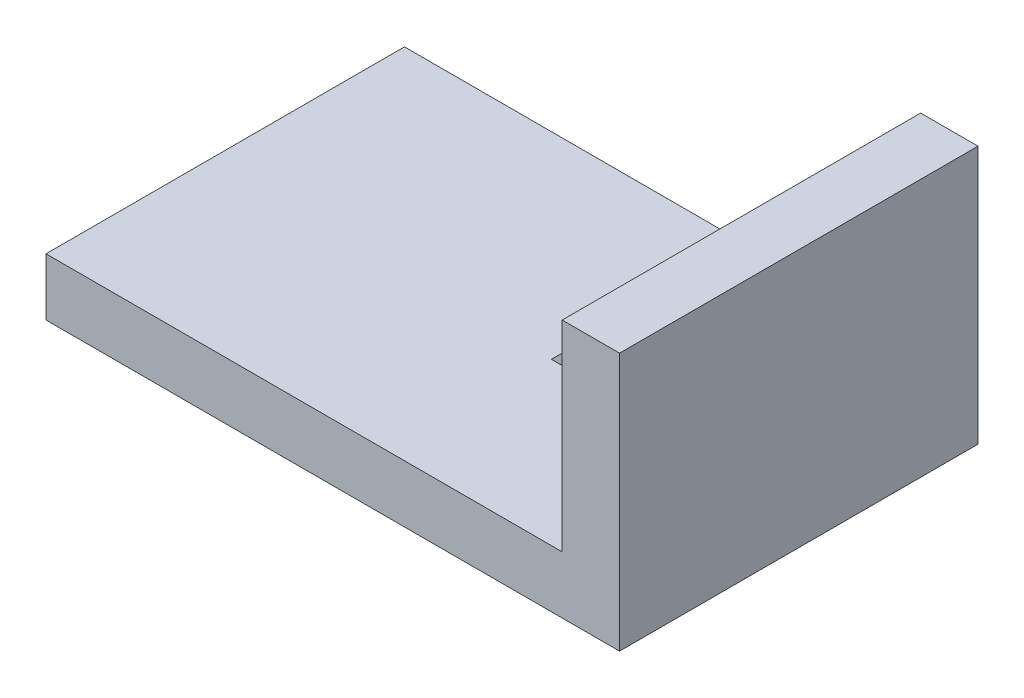
ISO-10303-21;
HEADER;
FILE_DESCRIPTION(('STEP AP214'),'2;1');
FILE_NAME('part.step','',(''),(''),'','','');
FILE_SCHEMA(('AUTOMOTIVE_DESIGN { 1 0 10303 214 1 1 1 1 }'));
ENDSEC;
DATA;
#1=APPLICATION_CONTEXT('core data for automotive mechanical design processes');
#2=APPLICATION_PROTOCOL_DEFINITION('international standard','automotive_design',2000,#1);
#3=PRODUCT_CONTEXT('',#1,'mechanical');
#4=PRODUCT('Part','Part','',(#3));
#5=PRODUCT_RELATED_PRODUCT_CATEGORY('part','',(#4));
#6=PRODUCT_DEFINITION_FORMATION('','',#4);
#7=PRODUCT_DEFINITION_CONTEXT('part definition',#1,'design');
#8=PRODUCT_DEFINITION('design','',#6,#7);
#9=PRODUCT_DEFINITION_SHAPE('','',#8);
#10=(LENGTH_UNIT() NAMED_UNIT(*) SI_UNIT(.MILLI.,.METRE.));
#11=(NAMED_UNIT(*) PLANE_ANGLE_UNIT() SI_UNIT($,.RADIAN.));
#12=(NAMED_UNIT(*) SI_UNIT($,.STERADIAN.) SOLID_ANGLE_UNIT());
#13=UNCERTAINTY_MEASURE_WITH_UNIT(LENGTH_MEASURE(1.E-05),#10,'distance_accuracy_value','');
#14=(GEOMETRIC_REPRESENTATION_CONTEXT(3) GLOBAL_UNCERTAINTY_ASSIGNED_CONTEXT((#13)) GLOBAL_UNIT_ASSIGNED_CONTEXT((#10,
#11,#12)) REPRESENTATION_CONTEXT('',''));
#15=CARTESIAN_POINT('',(0.,0.,0.));
#16=DIRECTION('',(0.,0.,1.));
#17=DIRECTION('',(1.,0.,0.));
#18=AXIS2_PLACEMENT_3D('',#15,#16,#17);
#19=CARTESIAN_POINT('',(-40.,8.,25.));
#20=DIRECTION('',(1.,0.,0.));
#21=DIRECTION('',(0.,0.,-1.));
#22=AXIS2_PLACEMENT_3D('',#19,#20,#21);
#23=PLANE('',#22);
#24=DIRECTION('',(0.,-1.,0.));
#25=VECTOR('',#24,1.);
#26=CARTESIAN_POINT('',(-40.,8.,-25.));
#27=LINE('',#26,#25);
#28=CARTESIAN_POINT('',(-40.,8.,-25.));
#29=VERTEX_POINT('',#28);
#30=CARTESIAN_POINT('',(-40.,0.,-25.));
#31=VERTEX_POINT('',#30);
#32=EDGE_CURVE('E153',#29,#31,#27,.T.);
#33=ORIENTED_EDGE('',*,*,#32,.T.);
#34=DIRECTION('',(0.,0.,-1.));
#35=VECTOR('',#34,1.);
#36=CARTESIAN_POINT('',(-40.,0.,25.));
#37=LINE('',#36,#35);
#38=CARTESIAN_POINT('',(-40.,0.,25.));
#39=VERTEX_POINT('',#38);
#40=EDGE_CURVE('E11',#39,#31,#37,.T.);
#41=ORIENTED_EDGE('',*,*,#40,.F.);
#42=DIRECTION('',(0.,-1.,0.));
#43=VECTOR('',#42,1.);
#44=CARTESIAN_POINT('',(-40.,8.,25.));
#45=LINE('',#44,#43);
#46=CARTESIAN_POINT('',(-40.,8.,25.));
#47=VERTEX_POINT('',#46);
#48=EDGE_CURVE('E154',#47,#39,#45,.T.);
#49=ORIENTED_EDGE('',*,*,#48,.F.);
#50=DIRECTION('',(0.,0.,-1.));
#51=VECTOR('',#50,1.);
#52=CARTESIAN_POINT('',(-40.,8.,25.));
#53=LINE('',#52,#51);
#54=EDGE_CURVE('E173',#47,#29,#53,.T.);
#55=ORIENTED_EDGE('',*,*,#54,.T.);
#56=EDGE_LOOP('',(#33,#41,#49,#55));
#57=FACE_BOUND('',#56,.T.);
#58=ADVANCED_FACE('F51',(#57),#23,.F.);
#59=CARTESIAN_POINT('',(-40.,0.,25.));
#60=DIRECTION('',(0.,1.,0.));
#61=DIRECTION('',(0.,0.,1.));
#62=AXIS2_PLACEMENT_3D('',#59,#60,#61);
#63=PLANE('',#62);
#64=DIRECTION('',(1.,0.,0.));
#65=VECTOR('',#64,1.);
#66=CARTESIAN_POINT('',(-40.,0.,-25.));
#67=LINE('',#66,#65);
#68=CARTESIAN_POINT('',(40.,0.,-25.));
#69=VERTEX_POINT('',#68);
#70=EDGE_CURVE('E176',#31,#69,#67,.T.);
#71=ORIENTED_EDGE('',*,*,#70,.T.);
#72=DIRECTION('',(0.,0.,-1.));
#73=VECTOR('',#72,1.);
#74=CARTESIAN_POINT('',(40.,0.,25.));
#75=LINE('',#74,#73);
#76=CARTESIAN_POINT('',(40.,0.,25.));
#77=VERTEX_POINT('',#76);
#78=EDGE_CURVE('E60',#77,#69,#75,.T.);
#79=ORIENTED_EDGE('',*,*,#78,.F.);
#80=DIRECTION('',(1.,0.,0.));
#81=VECTOR('',#80,1.);
#82=CARTESIAN_POINT('',(-40.,0.,25.));
#83=LINE('',#82,#81);
#84=EDGE_CURVE('E158',#39,#77,#83,.T.);
#85=ORIENTED_EDGE('',*,*,#84,.F.);
#86=ORIENTED_EDGE('',*,*,#40,.T.);
#87=EDGE_LOOP('',(#71,#79,#85,#86));
#88=FACE_BOUND('',#87,.T.);
#89=ADVANCED_FACE('F234',(#88),#63,.F.);
#90=CARTESIAN_POINT('',(40.,0.,25.));
#91=DIRECTION('',(-1.,0.,0.));
#92=DIRECTION('',(0.,0.,1.));
#93=AXIS2_PLACEMENT_3D('',#90,#91,#92);
#94=PLANE('',#93);
#95=DIRECTION('',(0.,1.,0.));
#96=VECTOR('',#95,1.);
#97=CARTESIAN_POINT('',(40.,0.,-25.));
#98=LINE('',#97,#96);
#99=CARTESIAN_POINT('',(40.,36.,-25.));
#100=VERTEX_POINT('',#99);
#101=EDGE_CURVE('E179',#69,#100,#98,.T.);
#102=ORIENTED_EDGE('',*,*,#101,.T.);
#103=DIRECTION('',(0.,0.,-1.));
#104=VECTOR('',#103,1.);
#105=CARTESIAN_POINT('',(40.,36.,25.));
#106=LINE('',#105,#104);
#107=CARTESIAN_POINT('',(40.,36.,25.));
#108=VERTEX_POINT('',#107);
#109=EDGE_CURVE('E202',#108,#100,#106,.T.);
#110=ORIENTED_EDGE('',*,*,#109,.F.);
#111=DIRECTION('',(0.,1.,0.));
#112=VECTOR('',#111,1.);
#113=CARTESIAN_POINT('',(40.,0.,25.));
#114=LINE('',#113,#112);
#115=EDGE_CURVE('E162',#77,#108,#114,.T.);
#116=ORIENTED_EDGE('',*,*,#115,.F.);
#117=ORIENTED_EDGE('',*,*,#78,.T.);
#118=EDGE_LOOP('',(#102,#110,#116,#117));
#119=FACE_BOUND('',#118,.T.);
#120=ADVANCED_FACE('F212',(#119),#94,.F.);
#121=CARTESIAN_POINT('',(40.,36.,25.));
#122=DIRECTION('',(0.,-1.,0.));
#123=DIRECTION('',(0.,0.,-1.));
#124=AXIS2_PLACEMENT_3D('',#121,#122,#123);
#125=PLANE('',#124);
#126=DIRECTION('',(-1.,0.,0.));
#127=VECTOR('',#126,1.);
#128=CARTESIAN_POINT('',(40.,36.,-25.));
#129=LINE('',#128,#127);
#130=CARTESIAN_POINT('',(32.,36.,-25.));
#131=VERTEX_POINT('',#130);
#132=EDGE_CURVE('E182',#100,#131,#129,.T.);
#133=ORIENTED_EDGE('',*,*,#132,.T.);
#134=DIRECTION('',(0.,0.,-1.));
#135=VECTOR('',#134,1.);
#136=CARTESIAN_POINT('',(32.,36.,25.));
#137=LINE('',#136,#135);
#138=CARTESIAN_POINT('',(32.,36.,25.));
#139=VERTEX_POINT('',#138);
#140=EDGE_CURVE('E198',#139,#131,#137,.T.);
#141=ORIENTED_EDGE('',*,*,#140,.F.);
#142=DIRECTION('',(-1.,0.,0.));
#143=VECTOR('',#142,1.);
#144=CARTESIAN_POINT('',(40.,36.,25.));
#145=LINE('',#144,#143);
#146=EDGE_CURVE('E164',#108,#139,#145,.T.);
#147=ORIENTED_EDGE('',*,*,#146,.F.);
#148=ORIENTED_EDGE('',*,*,#109,.T.);
#149=EDGE_LOOP('',(#133,#141,#147,#148));
#150=FACE_BOUND('',#149,.T.);
#151=ADVANCED_FACE('F223',(#150),#125,.F.);
#152=CARTESIAN_POINT('',(32.,36.,25.));
#153=DIRECTION('',(1.,0.,0.));
#154=DIRECTION('',(0.,0.,-1.));
#155=AXIS2_PLACEMENT_3D('',#152,#153,#154);
#156=PLANE('',#155);
#157=DIRECTION('',(0.,0.,-1.));
#158=VECTOR('',#157,1.);
#159=CARTESIAN_POINT('',(32.,32.,2.5));
#160=LINE('',#159,#158);
#161=CARTESIAN_POINT('',(32.,32.,2.5));
#162=VERTEX_POINT('',#161);
#163=CARTESIAN_POINT('',(32.,32.,-2.5));
#164=VERTEX_POINT('',#163);
#165=EDGE_CURVE('E67',#162,#164,#160,.T.);
#166=ORIENTED_EDGE('',*,*,#165,.F.);
#167=DIRECTION('',(0.,1.,0.));
#168=VECTOR('',#167,1.);
#169=CARTESIAN_POINT('',(32.,8.,2.5));
#170=LINE('',#169,#168);
#171=CARTESIAN_POINT('',(32.,8.,2.5));
#172=VERTEX_POINT('',#171);
#173=EDGE_CURVE('E238',#172,#162,#170,.T.);
#174=ORIENTED_EDGE('',*,*,#173,.F.);
#175=DIRECTION('',(0.,0.,-1.));
#176=VECTOR('',#175,1.);
#177=CARTESIAN_POINT('',(32.,8.,25.));
#178=LINE('',#177,#176);
#179=CARTESIAN_POINT('',(32.,8.,25.));
#180=VERTEX_POINT('',#179);
#181=EDGE_CURVE('E195',#180,#172,#178,.T.);
#182=ORIENTED_EDGE('',*,*,#181,.F.);
#183=DIRECTION('',(0.,-1.,0.));
#184=VECTOR('',#183,1.);
#185=CARTESIAN_POINT('',(32.,36.,25.));
#186=LINE('',#185,#184);
#187=EDGE_CURVE('E167',#139,#180,#186,.T.);
#188=ORIENTED_EDGE('',*,*,#187,.F.);
#189=ORIENTED_EDGE('',*,*,#140,.T.);
#190=DIRECTION('',(0.,-1.,0.));
#191=VECTOR('',#190,1.);
#192=CARTESIAN_POINT('',(32.,36.,-25.));
#193=LINE('',#192,#191);
#194=CARTESIAN_POINT('',(32.,8.,-25.));
#195=VERTEX_POINT('',#194);
#196=EDGE_CURVE('E185',#131,#195,#193,.T.);
#197=ORIENTED_EDGE('',*,*,#196,.T.);
#198=CARTESIAN_POINT('',(32.,8.,-2.5));
#199=VERTEX_POINT('',#198);
#200=EDGE_CURVE('E194',#199,#195,#178,.T.);
#201=ORIENTED_EDGE('',*,*,#200,.F.);
#202=DIRECTION('',(0.,1.,0.));
#203=VECTOR('',#202,1.);
#204=CARTESIAN_POINT('',(32.,8.,-2.5));
#205=LINE('',#204,#203);
#206=EDGE_CURVE('E72',#199,#164,#205,.T.);
#207=ORIENTED_EDGE('',*,*,#206,.T.);
#208=EDGE_LOOP('',(#166,#174,#182,#188,#189,#197,#201,#207));
#209=FACE_BOUND('',#208,.T.);
#210=ADVANCED_FACE('F226',(#209),#156,.F.);
#211=CARTESIAN_POINT('',(32.,8.,25.));
#212=DIRECTION('',(0.,-1.,0.));
#213=DIRECTION('',(0.,0.,-1.));
#214=AXIS2_PLACEMENT_3D('',#211,#212,#213);
#215=PLANE('',#214);
#216=ORIENTED_EDGE('',*,*,#181,.T.);
#217=DIRECTION('',(1.,0.,0.));
#218=VECTOR('',#217,1.);
#219=CARTESIAN_POINT('',(8.,8.,2.5));
#220=LINE('',#219,#218);
#221=CARTESIAN_POINT('',(8.,8.,2.5));
#222=VERTEX_POINT('',#221);
#223=EDGE_CURVE('E128',#222,#172,#220,.T.);
#224=ORIENTED_EDGE('',*,*,#223,.F.);
#225=DIRECTION('',(0.,0.,-1.));
#226=VECTOR('',#225,1.);
#227=CARTESIAN_POINT('',(8.,8.,2.5));
#228=LINE('',#227,#226);
#229=CARTESIAN_POINT('',(8.,8.,-2.5));
#230=VERTEX_POINT('',#229);
#231=EDGE_CURVE('E121',#222,#230,#228,.T.);
#232=ORIENTED_EDGE('',*,*,#231,.T.);
#233=DIRECTION('',(1.,0.,0.));
#234=VECTOR('',#233,1.);
#235=CARTESIAN_POINT('',(8.,8.,-2.5));
#236=LINE('',#235,#234);
#237=EDGE_CURVE('E126',#230,#199,#236,.T.);
#238=ORIENTED_EDGE('',*,*,#237,.T.);
#239=ORIENTED_EDGE('',*,*,#200,.T.);
#240=DIRECTION('',(-1.,0.,0.));
#241=VECTOR('',#240,1.);
#242=CARTESIAN_POINT('',(32.,8.,-25.));
#243=LINE('',#242,#241);
#244=EDGE_CURVE('E159',#195,#29,#243,.T.);
#245=ORIENTED_EDGE('',*,*,#244,.T.);
#246=ORIENTED_EDGE('',*,*,#54,.F.);
#247=DIRECTION('',(-1.,0.,0.));
#248=VECTOR('',#247,1.);
#249=CARTESIAN_POINT('',(32.,8.,25.));
#250=LINE('',#249,#248);
#251=EDGE_CURVE('E170',#180,#47,#250,.T.);
#252=ORIENTED_EDGE('',*,*,#251,.F.);
#253=EDGE_LOOP('',(#216,#224,#232,#238,#239,#245,#246,#252));
#254=FACE_BOUND('',#253,.T.);
#255=ADVANCED_FACE('F124',(#254),#215,.F.);
#256=CARTESIAN_POINT('',(0.,0.,25.));
#257=DIRECTION('',(0.,0.,1.));
#258=DIRECTION('',(1.,0.,0.));
#259=AXIS2_PLACEMENT_3D('',#256,#257,#258);
#260=PLANE('',#259);
#261=ORIENTED_EDGE('',*,*,#48,.T.);
#262=ORIENTED_EDGE('',*,*,#84,.T.);
#263=ORIENTED_EDGE('',*,*,#115,.T.);
#264=ORIENTED_EDGE('',*,*,#146,.T.);
#265=ORIENTED_EDGE('',*,*,#187,.T.);
#266=ORIENTED_EDGE('',*,*,#251,.T.);
#267=EDGE_LOOP('',(#261,#262,#263,#264,#265,#266));
#268=FACE_BOUND('',#267,.T.);
#269=ADVANCED_FACE('F230',(#268),#260,.T.);
#270=CARTESIAN_POINT('',(0.,0.,-25.));
#271=DIRECTION('',(0.,0.,1.));
#272=DIRECTION('',(1.,0.,0.));
#273=AXIS2_PLACEMENT_3D('',#270,#271,#272);
#274=PLANE('',#273);
#275=ORIENTED_EDGE('',*,*,#32,.F.);
#276=ORIENTED_EDGE('',*,*,#244,.F.);
#277=ORIENTED_EDGE('',*,*,#196,.F.);
#278=ORIENTED_EDGE('',*,*,#132,.F.);
#279=ORIENTED_EDGE('',*,*,#101,.F.);
#280=ORIENTED_EDGE('',*,*,#70,.F.);
#281=EDGE_LOOP('',(#275,#276,#277,#278,#279,#280));
#282=FACE_BOUND('',#281,.T.);
#283=ADVANCED_FACE('F218',(#282),#274,.F.);
#284=CARTESIAN_POINT('',(32.,32.,2.5));
#285=DIRECTION('',(0.707106781186548,-0.707106781186548,0.));
#286=DIRECTION('',(0.707106781186548,0.707106781186548,0.));
#287=AXIS2_PLACEMENT_3D('',#284,#285,#286);
#288=PLANE('',#287);
#289=DIRECTION('',(-0.707106781186548,-0.707106781186548,0.));
#290=VECTOR('',#289,1.);
#291=CARTESIAN_POINT('',(32.,32.,-2.5));
#292=LINE('',#291,#290);
#293=EDGE_CURVE('E136',#164,#230,#292,.T.);
#294=ORIENTED_EDGE('',*,*,#293,.T.);
#295=ORIENTED_EDGE('',*,*,#231,.F.);
#296=DIRECTION('',(-0.707106781186548,-0.707106781186548,0.));
#297=VECTOR('',#296,1.);
#298=CARTESIAN_POINT('',(32.,32.,2.5));
#299=LINE('',#298,#297);
#300=EDGE_CURVE('E133',#162,#222,#299,.T.);
#301=ORIENTED_EDGE('',*,*,#300,.F.);
#302=ORIENTED_EDGE('',*,*,#165,.T.);
#303=EDGE_LOOP('',(#294,#295,#301,#302));
#304=FACE_BOUND('',#303,.T.);
#305=ADVANCED_FACE('F137',(#304),#288,.F.);
#306=CARTESIAN_POINT('',(0.,0.,2.5));
#307=DIRECTION('',(0.,0.,1.));
#308=DIRECTION('',(1.,0.,0.));
#309=AXIS2_PLACEMENT_3D('',#306,#307,#308);
#310=PLANE('',#309);
#311=ORIENTED_EDGE('',*,*,#223,.T.);
#312=ORIENTED_EDGE('',*,*,#173,.T.);
#313=ORIENTED_EDGE('',*,*,#300,.T.);
#314=EDGE_LOOP('',(#311,#312,#313));
#315=FACE_BOUND('',#314,.T.);
#316=ADVANCED_FACE('F241',(#315),#310,.T.);
#317=CARTESIAN_POINT('',(0.,0.,-2.5));
#318=DIRECTION('',(0.,0.,1.));
#319=DIRECTION('',(1.,0.,0.));
#320=AXIS2_PLACEMENT_3D('',#317,#318,#319);
#321=PLANE('',#320);
#322=ORIENTED_EDGE('',*,*,#237,.F.);
#323=ORIENTED_EDGE('',*,*,#293,.F.);
#324=ORIENTED_EDGE('',*,*,#206,.F.);
#325=EDGE_LOOP('',(#322,#323,#324));
#326=FACE_BOUND('',#325,.T.);
#327=ADVANCED_FACE('F141',(#326),#321,.F.);
#328=CLOSED_SHELL('',(#58,#89,#120,#151,#210,#255,#269,#283,#305,#316,#327));
#329=MANIFOLD_SOLID_BREP('B2',#328);
#330=ADVANCED_BREP_SHAPE_REPRESENTATION('',(#18,#329),#14);
#331=SHAPE_DEFINITION_REPRESENTATION(#9,#330);
ENDSEC;
END-ISO-10303-21;
